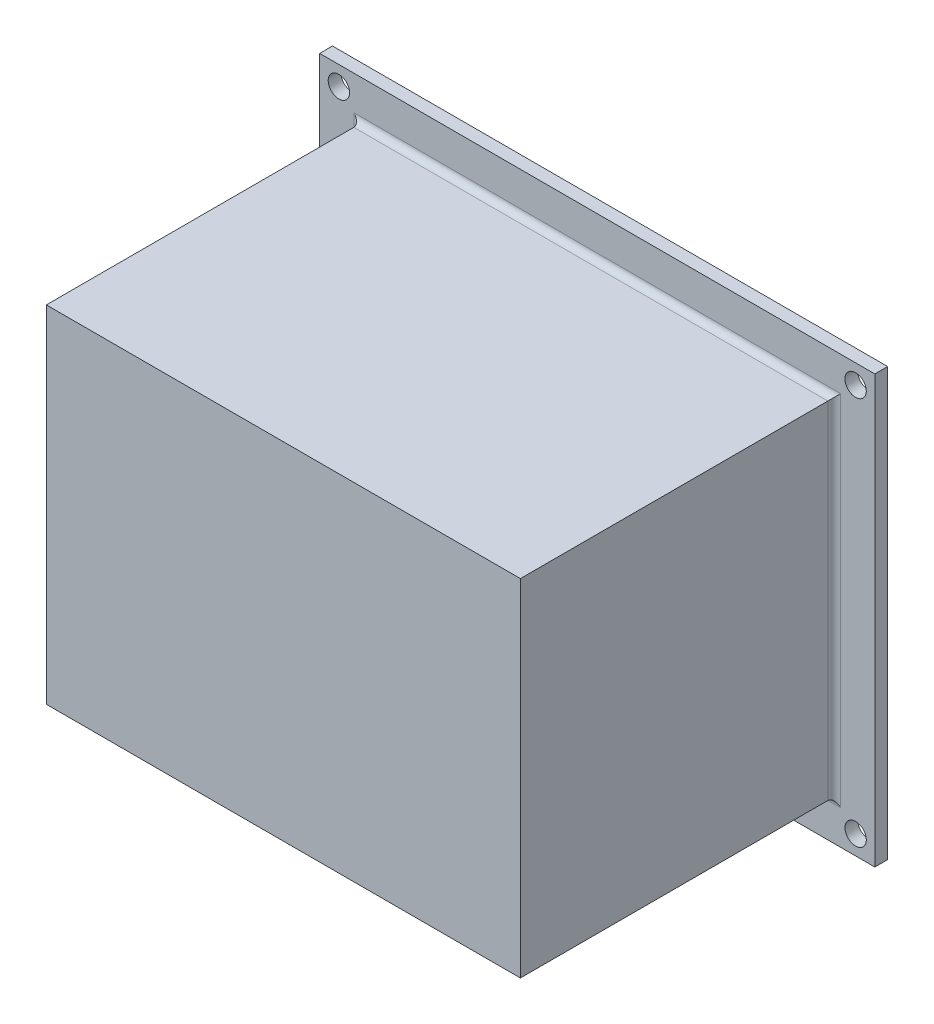
ISO-10303-21;
HEADER;
FILE_DESCRIPTION(('STEP AP214'),'2;1');
FILE_NAME('part.step','',(''),(''),'','','');
FILE_SCHEMA(('AUTOMOTIVE_DESIGN { 1 0 10303 214 1 1 1 1 }'));
ENDSEC;
DATA;
#1=APPLICATION_CONTEXT('core data for automotive mechanical design processes');
#2=APPLICATION_PROTOCOL_DEFINITION('international standard','automotive_design',2000,#1);
#3=PRODUCT_CONTEXT('',#1,'mechanical');
#4=PRODUCT('Part','Part','',(#3));
#5=PRODUCT_RELATED_PRODUCT_CATEGORY('part','',(#4));
#6=PRODUCT_DEFINITION_FORMATION('','',#4);
#7=PRODUCT_DEFINITION_CONTEXT('part definition',#1,'design');
#8=PRODUCT_DEFINITION('design','',#6,#7);
#9=PRODUCT_DEFINITION_SHAPE('','',#8);
#10=(LENGTH_UNIT() NAMED_UNIT(*) SI_UNIT(.MILLI.,.METRE.));
#11=(NAMED_UNIT(*) PLANE_ANGLE_UNIT() SI_UNIT($,.RADIAN.));
#12=(NAMED_UNIT(*) SI_UNIT($,.STERADIAN.) SOLID_ANGLE_UNIT());
#13=UNCERTAINTY_MEASURE_WITH_UNIT(LENGTH_MEASURE(1.E-05),#10,'distance_accuracy_value','');
#14=(GEOMETRIC_REPRESENTATION_CONTEXT(3) GLOBAL_UNCERTAINTY_ASSIGNED_CONTEXT((#13)) GLOBAL_UNIT_ASSIGNED_CONTEXT((#10,
#11,#12)) REPRESENTATION_CONTEXT('',''));
#15=CARTESIAN_POINT('',(0.,0.,0.));
#16=DIRECTION('',(0.,0.,1.));
#17=DIRECTION('',(1.,0.,0.));
#18=AXIS2_PLACEMENT_3D('',#15,#16,#17);
#19=CARTESIAN_POINT('',(0.,0.,3.));
#20=DIRECTION('',(0.,0.,1.));
#21=DIRECTION('',(1.,0.,0.));
#22=AXIS2_PLACEMENT_3D('',#19,#20,#21);
#23=PLANE('',#22);
#24=CARTESIAN_POINT('',(-60.5,-45.5,3.));
#25=DIRECTION('',(0.,0.,1.));
#26=DIRECTION('',(-1.,0.,0.));
#27=AXIS2_PLACEMENT_3D('',#24,#25,#26);
#28=CIRCLE('',#27,2.5);
#29=CARTESIAN_POINT('',(-63.,-45.5,3.));
#30=VERTEX_POINT('',#29);
#31=EDGE_CURVE('E217',#30,#30,#28,.T.);
#32=ORIENTED_EDGE('',*,*,#31,.F.);
#33=EDGE_LOOP('',(#32));
#34=FACE_BOUND('',#33,.T.);
#35=CARTESIAN_POINT('',(60.5,-45.5,3.));
#36=DIRECTION('',(0.,0.,1.));
#37=DIRECTION('',(1.,0.,0.));
#38=AXIS2_PLACEMENT_3D('',#35,#36,#37);
#39=CIRCLE('',#38,2.5);
#40=CARTESIAN_POINT('',(63.,-45.5,3.));
#41=VERTEX_POINT('',#40);
#42=EDGE_CURVE('E223',#41,#41,#39,.T.);
#43=ORIENTED_EDGE('',*,*,#42,.F.);
#44=EDGE_LOOP('',(#43));
#45=FACE_BOUND('',#44,.T.);
#46=CARTESIAN_POINT('',(60.5,45.5,3.));
#47=DIRECTION('',(0.,0.,1.));
#48=DIRECTION('',(-1.,0.,0.));
#49=AXIS2_PLACEMENT_3D('',#46,#47,#48);
#50=CIRCLE('',#49,2.5);
#51=CARTESIAN_POINT('',(58.,45.5,3.));
#52=VERTEX_POINT('',#51);
#53=EDGE_CURVE('E218',#52,#52,#50,.T.);
#54=ORIENTED_EDGE('',*,*,#53,.F.);
#55=EDGE_LOOP('',(#54));
#56=FACE_BOUND('',#55,.T.);
#57=CARTESIAN_POINT('',(-60.5,45.5,3.));
#58=DIRECTION('',(0.,0.,1.));
#59=DIRECTION('',(1.,0.,0.));
#60=AXIS2_PLACEMENT_3D('',#57,#58,#59);
#61=CIRCLE('',#60,2.5);
#62=CARTESIAN_POINT('',(-58.,45.5,3.));
#63=VERTEX_POINT('',#62);
#64=EDGE_CURVE('E222',#63,#63,#61,.T.);
#65=ORIENTED_EDGE('',*,*,#64,.F.);
#66=EDGE_LOOP('',(#65));
#67=FACE_BOUND('',#66,.T.);
#68=DIRECTION('',(0.,1.,0.));
#69=VECTOR('',#68,1.);
#70=CARTESIAN_POINT('',(57.,0.,3.));
#71=LINE('',#70,#69);
#72=CARTESIAN_POINT('',(57.,42.,3.));
#73=VERTEX_POINT('',#72);
#74=CARTESIAN_POINT('',(57.,-42.,3.));
#75=VERTEX_POINT('',#74);
#76=EDGE_CURVE('E330',#73,#75,#71,.F.);
#77=ORIENTED_EDGE('',*,*,#76,.T.);
#78=DIRECTION('',(1.,0.,0.));
#79=VECTOR('',#78,1.);
#80=CARTESIAN_POINT('',(0.,-42.,3.));
#81=LINE('',#80,#79);
#82=CARTESIAN_POINT('',(-57.,-42.,3.));
#83=VERTEX_POINT('',#82);
#84=EDGE_CURVE('E339',#75,#83,#81,.F.);
#85=ORIENTED_EDGE('',*,*,#84,.T.);
#86=DIRECTION('',(0.,-1.,0.));
#87=VECTOR('',#86,1.);
#88=CARTESIAN_POINT('',(-57.,0.,3.));
#89=LINE('',#88,#87);
#90=CARTESIAN_POINT('',(-57.,42.,3.));
#91=VERTEX_POINT('',#90);
#92=EDGE_CURVE('E336',#83,#91,#89,.F.);
#93=ORIENTED_EDGE('',*,*,#92,.T.);
#94=DIRECTION('',(-1.,0.,0.));
#95=VECTOR('',#94,1.);
#96=CARTESIAN_POINT('',(0.,42.,3.));
#97=LINE('',#96,#95);
#98=EDGE_CURVE('E333',#91,#73,#97,.F.);
#99=ORIENTED_EDGE('',*,*,#98,.T.);
#100=EDGE_LOOP('',(#77,#85,#93,#99));
#101=FACE_BOUND('',#100,.T.);
#102=DIRECTION('',(0.,1.,0.));
#103=VECTOR('',#102,1.);
#104=CARTESIAN_POINT('',(65.,50.,3.));
#105=LINE('',#104,#103);
#106=CARTESIAN_POINT('',(65.,-50.,3.));
#107=VERTEX_POINT('',#106);
#108=CARTESIAN_POINT('',(65.,50.,3.));
#109=VERTEX_POINT('',#108);
#110=EDGE_CURVE('E285',#107,#109,#105,.T.);
#111=ORIENTED_EDGE('',*,*,#110,.T.);
#112=DIRECTION('',(-1.,0.,0.));
#113=VECTOR('',#112,1.);
#114=CARTESIAN_POINT('',(-65.,50.,3.));
#115=LINE('',#114,#113);
#116=CARTESIAN_POINT('',(-65.,50.,3.));
#117=VERTEX_POINT('',#116);
#118=EDGE_CURVE('E289',#109,#117,#115,.T.);
#119=ORIENTED_EDGE('',*,*,#118,.T.);
#120=DIRECTION('',(0.,-1.,0.));
#121=VECTOR('',#120,1.);
#122=CARTESIAN_POINT('',(-65.,50.,3.));
#123=LINE('',#122,#121);
#124=CARTESIAN_POINT('',(-65.,-50.,3.));
#125=VERTEX_POINT('',#124);
#126=EDGE_CURVE('E293',#117,#125,#123,.T.);
#127=ORIENTED_EDGE('',*,*,#126,.T.);
#128=DIRECTION('',(1.,0.,0.));
#129=VECTOR('',#128,1.);
#130=CARTESIAN_POINT('',(-65.,-50.,3.));
#131=LINE('',#130,#129);
#132=EDGE_CURVE('E296',#125,#107,#131,.T.);
#133=ORIENTED_EDGE('',*,*,#132,.T.);
#134=EDGE_LOOP('',(#111,#119,#127,#133));
#135=FACE_BOUND('',#134,.T.);
#136=ADVANCED_FACE('F39',(#34,#45,#56,#67,#101,#135),#23,.T.);
#137=CARTESIAN_POINT('',(0.,0.,0.));
#138=DIRECTION('',(0.,0.,1.));
#139=DIRECTION('',(1.,0.,0.));
#140=AXIS2_PLACEMENT_3D('',#137,#138,#139);
#141=PLANE('',#140);
#142=CARTESIAN_POINT('',(-60.5,-45.5,0.));
#143=DIRECTION('',(0.,0.,1.));
#144=DIRECTION('',(1.,0.,0.));
#145=AXIS2_PLACEMENT_3D('',#142,#143,#144);
#146=CIRCLE('',#145,2.5);
#147=CARTESIAN_POINT('',(-58.,-45.5,0.));
#148=VERTEX_POINT('',#147);
#149=EDGE_CURVE('E43',#148,#148,#146,.T.);
#150=ORIENTED_EDGE('',*,*,#149,.T.);
#151=EDGE_LOOP('',(#150));
#152=FACE_BOUND('',#151,.T.);
#153=CARTESIAN_POINT('',(60.5,-45.5,0.));
#154=DIRECTION('',(0.,0.,1.));
#155=DIRECTION('',(1.,0.,0.));
#156=AXIS2_PLACEMENT_3D('',#153,#154,#155);
#157=CIRCLE('',#156,2.5);
#158=CARTESIAN_POINT('',(63.,-45.5,0.));
#159=VERTEX_POINT('',#158);
#160=EDGE_CURVE('E367',#159,#159,#157,.T.);
#161=ORIENTED_EDGE('',*,*,#160,.T.);
#162=EDGE_LOOP('',(#161));
#163=FACE_BOUND('',#162,.T.);
#164=CARTESIAN_POINT('',(60.5,45.5,0.));
#165=DIRECTION('',(0.,0.,1.));
#166=DIRECTION('',(1.,0.,0.));
#167=AXIS2_PLACEMENT_3D('',#164,#165,#166);
#168=CIRCLE('',#167,2.5);
#169=CARTESIAN_POINT('',(63.,45.5,0.));
#170=VERTEX_POINT('',#169);
#171=EDGE_CURVE('E364',#170,#170,#168,.T.);
#172=ORIENTED_EDGE('',*,*,#171,.T.);
#173=EDGE_LOOP('',(#172));
#174=FACE_BOUND('',#173,.T.);
#175=CARTESIAN_POINT('',(-60.5,45.5,0.));
#176=DIRECTION('',(0.,0.,1.));
#177=DIRECTION('',(1.,0.,0.));
#178=AXIS2_PLACEMENT_3D('',#175,#176,#177);
#179=CIRCLE('',#178,2.5);
#180=CARTESIAN_POINT('',(-58.,45.5,0.));
#181=VERTEX_POINT('',#180);
#182=EDGE_CURVE('E233',#181,#181,#179,.T.);
#183=ORIENTED_EDGE('',*,*,#182,.T.);
#184=EDGE_LOOP('',(#183));
#185=FACE_BOUND('',#184,.T.);
#186=DIRECTION('',(0.,1.,0.));
#187=VECTOR('',#186,1.);
#188=CARTESIAN_POINT('',(65.,50.,0.));
#189=LINE('',#188,#187);
#190=CARTESIAN_POINT('',(65.,-50.,0.));
#191=VERTEX_POINT('',#190);
#192=CARTESIAN_POINT('',(65.,50.,0.));
#193=VERTEX_POINT('',#192);
#194=EDGE_CURVE('E284',#191,#193,#189,.T.);
#195=ORIENTED_EDGE('',*,*,#194,.F.);
#196=DIRECTION('',(1.,0.,0.));
#197=VECTOR('',#196,1.);
#198=CARTESIAN_POINT('',(-65.,-50.,0.));
#199=LINE('',#198,#197);
#200=CARTESIAN_POINT('',(-65.,-50.,0.));
#201=VERTEX_POINT('',#200);
#202=EDGE_CURVE('E290',#201,#191,#199,.T.);
#203=ORIENTED_EDGE('',*,*,#202,.F.);
#204=DIRECTION('',(0.,-1.,0.));
#205=VECTOR('',#204,1.);
#206=CARTESIAN_POINT('',(-65.,50.,0.));
#207=LINE('',#206,#205);
#208=CARTESIAN_POINT('',(-65.,50.,0.));
#209=VERTEX_POINT('',#208);
#210=EDGE_CURVE('E306',#209,#201,#207,.T.);
#211=ORIENTED_EDGE('',*,*,#210,.F.);
#212=DIRECTION('',(-1.,0.,0.));
#213=VECTOR('',#212,1.);
#214=CARTESIAN_POINT('',(-65.,50.,0.));
#215=LINE('',#214,#213);
#216=EDGE_CURVE('E303',#193,#209,#215,.T.);
#217=ORIENTED_EDGE('',*,*,#216,.F.);
#218=EDGE_LOOP('',(#195,#203,#211,#217));
#219=FACE_BOUND('',#218,.T.);
#220=DIRECTION('',(0.,1.,0.));
#221=VECTOR('',#220,1.);
#222=CARTESIAN_POINT('',(52.5,37.5,0.));
#223=LINE('',#222,#221);
#224=CARTESIAN_POINT('',(52.5,-37.5,0.));
#225=VERTEX_POINT('',#224);
#226=CARTESIAN_POINT('',(52.5,37.5,0.));
#227=VERTEX_POINT('',#226);
#228=EDGE_CURVE('E264',#225,#227,#223,.T.);
#229=ORIENTED_EDGE('',*,*,#228,.T.);
#230=DIRECTION('',(-1.,0.,0.));
#231=VECTOR('',#230,1.);
#232=CARTESIAN_POINT('',(-52.5,37.5,0.));
#233=LINE('',#232,#231);
#234=CARTESIAN_POINT('',(-52.5,37.5,0.));
#235=VERTEX_POINT('',#234);
#236=EDGE_CURVE('E268',#227,#235,#233,.T.);
#237=ORIENTED_EDGE('',*,*,#236,.T.);
#238=DIRECTION('',(0.,-1.,0.));
#239=VECTOR('',#238,1.);
#240=CARTESIAN_POINT('',(-52.5,37.5,0.));
#241=LINE('',#240,#239);
#242=CARTESIAN_POINT('',(-52.5,-37.5,0.));
#243=VERTEX_POINT('',#242);
#244=EDGE_CURVE('E272',#235,#243,#241,.T.);
#245=ORIENTED_EDGE('',*,*,#244,.T.);
#246=DIRECTION('',(1.,0.,0.));
#247=VECTOR('',#246,1.);
#248=CARTESIAN_POINT('',(-52.5,-37.5,0.));
#249=LINE('',#248,#247);
#250=EDGE_CURVE('E166',#243,#225,#249,.T.);
#251=ORIENTED_EDGE('',*,*,#250,.T.);
#252=EDGE_LOOP('',(#229,#237,#245,#251));
#253=FACE_BOUND('',#252,.T.);
#254=ADVANCED_FACE('F376',(#152,#163,#174,#185,#219,#253),#141,.F.);
#255=CARTESIAN_POINT('',(65.,50.,3.));
#256=DIRECTION('',(-1.,0.,0.));
#257=DIRECTION('',(0.,0.,1.));
#258=AXIS2_PLACEMENT_3D('',#255,#256,#257);
#259=PLANE('',#258);
#260=ORIENTED_EDGE('',*,*,#194,.T.);
#261=DIRECTION('',(0.,0.,-1.));
#262=VECTOR('',#261,1.);
#263=CARTESIAN_POINT('',(65.,50.,3.));
#264=LINE('',#263,#262);
#265=EDGE_CURVE('E322',#109,#193,#264,.T.);
#266=ORIENTED_EDGE('',*,*,#265,.F.);
#267=ORIENTED_EDGE('',*,*,#110,.F.);
#268=DIRECTION('',(0.,0.,-1.));
#269=VECTOR('',#268,1.);
#270=CARTESIAN_POINT('',(65.,-50.,3.));
#271=LINE('',#270,#269);
#272=EDGE_CURVE('E299',#107,#191,#271,.T.);
#273=ORIENTED_EDGE('',*,*,#272,.T.);
#274=EDGE_LOOP('',(#260,#266,#267,#273));
#275=FACE_BOUND('',#274,.T.);
#276=ADVANCED_FACE('F401',(#275),#259,.F.);
#277=CARTESIAN_POINT('',(-65.,50.,3.));
#278=DIRECTION('',(0.,-1.,0.));
#279=DIRECTION('',(0.,0.,-1.));
#280=AXIS2_PLACEMENT_3D('',#277,#278,#279);
#281=PLANE('',#280);
#282=ORIENTED_EDGE('',*,*,#216,.T.);
#283=DIRECTION('',(0.,0.,-1.));
#284=VECTOR('',#283,1.);
#285=CARTESIAN_POINT('',(-65.,50.,3.));
#286=LINE('',#285,#284);
#287=EDGE_CURVE('E318',#117,#209,#286,.T.);
#288=ORIENTED_EDGE('',*,*,#287,.F.);
#289=ORIENTED_EDGE('',*,*,#118,.F.);
#290=ORIENTED_EDGE('',*,*,#265,.T.);
#291=EDGE_LOOP('',(#282,#288,#289,#290));
#292=FACE_BOUND('',#291,.T.);
#293=ADVANCED_FACE('F416',(#292),#281,.F.);
#294=CARTESIAN_POINT('',(-65.,50.,3.));
#295=DIRECTION('',(1.,0.,0.));
#296=DIRECTION('',(0.,0.,-1.));
#297=AXIS2_PLACEMENT_3D('',#294,#295,#296);
#298=PLANE('',#297);
#299=ORIENTED_EDGE('',*,*,#210,.T.);
#300=DIRECTION('',(0.,0.,-1.));
#301=VECTOR('',#300,1.);
#302=CARTESIAN_POINT('',(-65.,-50.,3.));
#303=LINE('',#302,#301);
#304=EDGE_CURVE('E314',#125,#201,#303,.T.);
#305=ORIENTED_EDGE('',*,*,#304,.F.);
#306=ORIENTED_EDGE('',*,*,#126,.F.);
#307=ORIENTED_EDGE('',*,*,#287,.T.);
#308=EDGE_LOOP('',(#299,#305,#306,#307));
#309=FACE_BOUND('',#308,.T.);
#310=ADVANCED_FACE('F412',(#309),#298,.F.);
#311=CARTESIAN_POINT('',(-65.,-50.,3.));
#312=DIRECTION('',(0.,1.,0.));
#313=DIRECTION('',(0.,0.,1.));
#314=AXIS2_PLACEMENT_3D('',#311,#312,#313);
#315=PLANE('',#314);
#316=ORIENTED_EDGE('',*,*,#202,.T.);
#317=ORIENTED_EDGE('',*,*,#272,.F.);
#318=ORIENTED_EDGE('',*,*,#132,.F.);
#319=ORIENTED_EDGE('',*,*,#304,.T.);
#320=EDGE_LOOP('',(#316,#317,#318,#319));
#321=FACE_BOUND('',#320,.T.);
#322=ADVANCED_FACE('F409',(#321),#315,.F.);
#323=CARTESIAN_POINT('',(52.5,37.5,3.));
#324=DIRECTION('',(-1.,0.,0.));
#325=DIRECTION('',(0.,0.,1.));
#326=AXIS2_PLACEMENT_3D('',#323,#324,#325);
#327=PLANE('',#326);
#328=DIRECTION('',(0.,1.,0.));
#329=VECTOR('',#328,1.);
#330=CARTESIAN_POINT('',(52.5,-37.5,74.));
#331=LINE('',#330,#329);
#332=CARTESIAN_POINT('',(52.5,-37.5,74.));
#333=VERTEX_POINT('',#332);
#334=CARTESIAN_POINT('',(52.5,37.5,74.));
#335=VERTEX_POINT('',#334);
#336=EDGE_CURVE('E57',#333,#335,#331,.T.);
#337=ORIENTED_EDGE('',*,*,#336,.T.);
#338=DIRECTION('',(0.,0.,-1.));
#339=VECTOR('',#338,1.);
#340=CARTESIAN_POINT('',(52.5,37.5,3.));
#341=LINE('',#340,#339);
#342=EDGE_CURVE('E281',#335,#227,#341,.T.);
#343=ORIENTED_EDGE('',*,*,#342,.T.);
#344=ORIENTED_EDGE('',*,*,#228,.F.);
#345=DIRECTION('',(0.,0.,-1.));
#346=VECTOR('',#345,1.);
#347=CARTESIAN_POINT('',(52.5,-37.5,3.));
#348=LINE('',#347,#346);
#349=EDGE_CURVE('E172',#333,#225,#348,.T.);
#350=ORIENTED_EDGE('',*,*,#349,.F.);
#351=EDGE_LOOP('',(#337,#343,#344,#350));
#352=FACE_BOUND('',#351,.T.);
#353=ADVANCED_FACE('F406',(#352),#327,.T.);
#354=CARTESIAN_POINT('',(-52.5,37.5,3.));
#355=DIRECTION('',(0.,-1.,0.));
#356=DIRECTION('',(0.,0.,-1.));
#357=AXIS2_PLACEMENT_3D('',#354,#355,#356);
#358=PLANE('',#357);
#359=DIRECTION('',(-1.,0.,0.));
#360=VECTOR('',#359,1.);
#361=CARTESIAN_POINT('',(-52.5,37.5,74.));
#362=LINE('',#361,#360);
#363=CARTESIAN_POINT('',(-52.5,37.5,74.));
#364=VERTEX_POINT('',#363);
#365=EDGE_CURVE('E64',#335,#364,#362,.T.);
#366=ORIENTED_EDGE('',*,*,#365,.T.);
#367=DIRECTION('',(0.,0.,-1.));
#368=VECTOR('',#367,1.);
#369=CARTESIAN_POINT('',(-52.5,37.5,3.));
#370=LINE('',#369,#368);
#371=EDGE_CURVE('E171',#364,#235,#370,.T.);
#372=ORIENTED_EDGE('',*,*,#371,.T.);
#373=ORIENTED_EDGE('',*,*,#236,.F.);
#374=ORIENTED_EDGE('',*,*,#342,.F.);
#375=EDGE_LOOP('',(#366,#372,#373,#374));
#376=FACE_BOUND('',#375,.T.);
#377=ADVANCED_FACE('F484',(#376),#358,.T.);
#378=CARTESIAN_POINT('',(-52.5,37.5,3.));
#379=DIRECTION('',(1.,0.,0.));
#380=DIRECTION('',(0.,0.,-1.));
#381=AXIS2_PLACEMENT_3D('',#378,#379,#380);
#382=PLANE('',#381);
#383=DIRECTION('',(0.,-1.,0.));
#384=VECTOR('',#383,1.);
#385=CARTESIAN_POINT('',(-52.5,-37.5,74.));
#386=LINE('',#385,#384);
#387=CARTESIAN_POINT('',(-52.5,-37.5,74.));
#388=VERTEX_POINT('',#387);
#389=EDGE_CURVE('E175',#364,#388,#386,.T.);
#390=ORIENTED_EDGE('',*,*,#389,.T.);
#391=DIRECTION('',(0.,0.,-1.));
#392=VECTOR('',#391,1.);
#393=CARTESIAN_POINT('',(-52.5,-37.5,3.));
#394=LINE('',#393,#392);
#395=EDGE_CURVE('E160',#388,#243,#394,.T.);
#396=ORIENTED_EDGE('',*,*,#395,.T.);
#397=ORIENTED_EDGE('',*,*,#244,.F.);
#398=ORIENTED_EDGE('',*,*,#371,.F.);
#399=EDGE_LOOP('',(#390,#396,#397,#398));
#400=FACE_BOUND('',#399,.T.);
#401=DIRECTION('',(0.,0.5,0.866025403784438));
#402=VECTOR('',#401,1.);
#403=CARTESIAN_POINT('',(-52.5,-0.151279441628821,24.7379763209582));
#404=LINE('',#403,#402);
#405=CARTESIAN_POINT('',(-52.5,0.,25.));
#406=VERTEX_POINT('',#405);
#407=CARTESIAN_POINT('',(-52.5,12.9903810567666,47.5));
#408=VERTEX_POINT('',#407);
#409=EDGE_CURVE('E214',#406,#408,#404,.T.);
#410=ORIENTED_EDGE('',*,*,#409,.F.);
#411=DIRECTION('',(0.,0.5,-0.866025403784439));
#412=VECTOR('',#411,1.);
#413=CARTESIAN_POINT('',(-52.5,18.9012794416288,-7.73797632095823));
#414=LINE('',#413,#412);
#415=CARTESIAN_POINT('',(-52.5,-12.9903810567666,47.5));
#416=VERTEX_POINT('',#415);
#417=EDGE_CURVE('E201',#416,#406,#414,.T.);
#418=ORIENTED_EDGE('',*,*,#417,.F.);
#419=DIRECTION('',(0.,-1.,0.));
#420=VECTOR('',#419,1.);
#421=CARTESIAN_POINT('',(-52.5,37.5,47.5));
#422=LINE('',#421,#420);
#423=EDGE_CURVE('E210',#408,#416,#422,.T.);
#424=ORIENTED_EDGE('',*,*,#423,.F.);
#425=EDGE_LOOP('',(#410,#418,#424));
#426=FACE_BOUND('',#425,.T.);
#427=ADVANCED_FACE('F176',(#400,#426),#382,.T.);
#428=CARTESIAN_POINT('',(-52.5,-37.5,3.));
#429=DIRECTION('',(0.,1.,0.));
#430=DIRECTION('',(0.,0.,1.));
#431=AXIS2_PLACEMENT_3D('',#428,#429,#430);
#432=PLANE('',#431);
#433=DIRECTION('',(1.,0.,0.));
#434=VECTOR('',#433,1.);
#435=CARTESIAN_POINT('',(-52.5,-37.5,74.));
#436=LINE('',#435,#434);
#437=EDGE_CURVE('E164',#388,#333,#436,.T.);
#438=ORIENTED_EDGE('',*,*,#437,.T.);
#439=ORIENTED_EDGE('',*,*,#349,.T.);
#440=ORIENTED_EDGE('',*,*,#250,.F.);
#441=ORIENTED_EDGE('',*,*,#395,.F.);
#442=EDGE_LOOP('',(#438,#439,#440,#441));
#443=FACE_BOUND('',#442,.T.);
#444=ADVANCED_FACE('F162',(#443),#432,.T.);
#445=CARTESIAN_POINT('',(0.,0.,76.5));
#446=DIRECTION('',(0.,0.,1.));
#447=DIRECTION('',(1.,0.,0.));
#448=AXIS2_PLACEMENT_3D('',#445,#446,#447);
#449=PLANE('',#448);
#450=DIRECTION('',(0.,1.,0.));
#451=VECTOR('',#450,1.);
#452=CARTESIAN_POINT('',(55.5,40.5,76.5));
#453=LINE('',#452,#451);
#454=CARTESIAN_POINT('',(55.5,-40.5,76.5));
#455=VERTEX_POINT('',#454);
#456=CARTESIAN_POINT('',(55.5,40.5,76.5));
#457=VERTEX_POINT('',#456);
#458=EDGE_CURVE('E234',#455,#457,#453,.T.);
#459=ORIENTED_EDGE('',*,*,#458,.T.);
#460=DIRECTION('',(-1.,0.,0.));
#461=VECTOR('',#460,1.);
#462=CARTESIAN_POINT('',(-55.5,40.5,76.5));
#463=LINE('',#462,#461);
#464=CARTESIAN_POINT('',(-55.5,40.5,76.5));
#465=VERTEX_POINT('',#464);
#466=EDGE_CURVE('E238',#457,#465,#463,.T.);
#467=ORIENTED_EDGE('',*,*,#466,.T.);
#468=DIRECTION('',(0.,-1.,0.));
#469=VECTOR('',#468,1.);
#470=CARTESIAN_POINT('',(-55.5,40.5,76.5));
#471=LINE('',#470,#469);
#472=CARTESIAN_POINT('',(-55.5,-40.5,76.5));
#473=VERTEX_POINT('',#472);
#474=EDGE_CURVE('E242',#465,#473,#471,.T.);
#475=ORIENTED_EDGE('',*,*,#474,.T.);
#476=DIRECTION('',(1.,0.,0.));
#477=VECTOR('',#476,1.);
#478=CARTESIAN_POINT('',(-55.5,-40.5,76.5));
#479=LINE('',#478,#477);
#480=EDGE_CURVE('E245',#473,#455,#479,.T.);
#481=ORIENTED_EDGE('',*,*,#480,.T.);
#482=EDGE_LOOP('',(#459,#467,#475,#481));
#483=FACE_BOUND('',#482,.T.);
#484=ADVANCED_FACE('F463',(#483),#449,.T.);
#485=CARTESIAN_POINT('',(55.5,40.5,76.5));
#486=DIRECTION('',(-1.,0.,0.));
#487=DIRECTION('',(0.,0.,1.));
#488=AXIS2_PLACEMENT_3D('',#485,#486,#487);
#489=PLANE('',#488);
#490=DIRECTION('',(0.,0.,-1.));
#491=VECTOR('',#490,1.);
#492=CARTESIAN_POINT('',(55.5,-40.5,76.5));
#493=LINE('',#492,#491);
#494=CARTESIAN_POINT('',(55.5,-40.5,4.5));
#495=VERTEX_POINT('',#494);
#496=EDGE_CURVE('E248',#455,#495,#493,.T.);
#497=ORIENTED_EDGE('',*,*,#496,.T.);
#498=DIRECTION('',(0.,1.,0.));
#499=VECTOR('',#498,1.);
#500=CARTESIAN_POINT('',(55.5,40.5,4.5));
#501=LINE('',#500,#499);
#502=CARTESIAN_POINT('',(55.5,40.5,4.5));
#503=VERTEX_POINT('',#502);
#504=EDGE_CURVE('E11',#495,#503,#501,.T.);
#505=ORIENTED_EDGE('',*,*,#504,.T.);
#506=DIRECTION('',(0.,0.,-1.));
#507=VECTOR('',#506,1.);
#508=CARTESIAN_POINT('',(55.5,40.5,76.5));
#509=LINE('',#508,#507);
#510=EDGE_CURVE('E260',#457,#503,#509,.T.);
#511=ORIENTED_EDGE('',*,*,#510,.F.);
#512=ORIENTED_EDGE('',*,*,#458,.F.);
#513=EDGE_LOOP('',(#497,#505,#511,#512));
#514=FACE_BOUND('',#513,.T.);
#515=ADVANCED_FACE('F461',(#514),#489,.F.);
#516=CARTESIAN_POINT('',(-55.5,40.5,76.5));
#517=DIRECTION('',(0.,-1.,0.));
#518=DIRECTION('',(0.,0.,-1.));
#519=AXIS2_PLACEMENT_3D('',#516,#517,#518);
#520=PLANE('',#519);
#521=ORIENTED_EDGE('',*,*,#510,.T.);
#522=DIRECTION('',(-1.,0.,0.));
#523=VECTOR('',#522,1.);
#524=CARTESIAN_POINT('',(-55.5,40.5,4.5));
#525=LINE('',#524,#523);
#526=CARTESIAN_POINT('',(-55.5,40.5,4.5));
#527=VERTEX_POINT('',#526);
#528=EDGE_CURVE('E49',#503,#527,#525,.T.);
#529=ORIENTED_EDGE('',*,*,#528,.T.);
#530=DIRECTION('',(0.,0.,-1.));
#531=VECTOR('',#530,1.);
#532=CARTESIAN_POINT('',(-55.5,40.5,76.5));
#533=LINE('',#532,#531);
#534=EDGE_CURVE('E256',#465,#527,#533,.T.);
#535=ORIENTED_EDGE('',*,*,#534,.F.);
#536=ORIENTED_EDGE('',*,*,#466,.F.);
#537=EDGE_LOOP('',(#521,#529,#535,#536));
#538=FACE_BOUND('',#537,.T.);
#539=ADVANCED_FACE('F469',(#538),#520,.F.);
#540=CARTESIAN_POINT('',(-55.5,40.5,76.5));
#541=DIRECTION('',(1.,0.,0.));
#542=DIRECTION('',(0.,0.,-1.));
#543=AXIS2_PLACEMENT_3D('',#540,#541,#542);
#544=PLANE('',#543);
#545=DIRECTION('',(0.,-0.5,0.866025403784439));
#546=VECTOR('',#545,1.);
#547=CARTESIAN_POINT('',(-55.5,0.,25.));
#548=LINE('',#547,#546);
#549=CARTESIAN_POINT('',(-55.5,0.,25.));
#550=VERTEX_POINT('',#549);
#551=CARTESIAN_POINT('',(-55.5,-12.9903810567666,47.5));
#552=VERTEX_POINT('',#551);
#553=EDGE_CURVE('E186',#550,#552,#548,.T.);
#554=ORIENTED_EDGE('',*,*,#553,.F.);
#555=DIRECTION('',(0.,-0.5,-0.866025403784438));
#556=VECTOR('',#555,1.);
#557=CARTESIAN_POINT('',(-55.5,12.9903810567666,47.5));
#558=LINE('',#557,#556);
#559=CARTESIAN_POINT('',(-55.5,12.9903810567666,47.5));
#560=VERTEX_POINT('',#559);
#561=EDGE_CURVE('E183',#560,#550,#558,.T.);
#562=ORIENTED_EDGE('',*,*,#561,.F.);
#563=DIRECTION('',(0.,1.,0.));
#564=VECTOR('',#563,1.);
#565=CARTESIAN_POINT('',(-55.5,-12.9903810567666,47.5));
#566=LINE('',#565,#564);
#567=EDGE_CURVE('E193',#552,#560,#566,.T.);
#568=ORIENTED_EDGE('',*,*,#567,.F.);
#569=EDGE_LOOP('',(#554,#562,#568));
#570=FACE_BOUND('',#569,.T.);
#571=ORIENTED_EDGE('',*,*,#534,.T.);
#572=DIRECTION('',(0.,-1.,0.));
#573=VECTOR('',#572,1.);
#574=CARTESIAN_POINT('',(-55.5,40.5,4.5));
#575=LINE('',#574,#573);
#576=CARTESIAN_POINT('',(-55.5,-40.5,4.5));
#577=VERTEX_POINT('',#576);
#578=EDGE_CURVE('E343',#527,#577,#575,.T.);
#579=ORIENTED_EDGE('',*,*,#578,.T.);
#580=DIRECTION('',(0.,0.,-1.));
#581=VECTOR('',#580,1.);
#582=CARTESIAN_POINT('',(-55.5,-40.5,76.5));
#583=LINE('',#582,#581);
#584=EDGE_CURVE('E252',#473,#577,#583,.T.);
#585=ORIENTED_EDGE('',*,*,#584,.F.);
#586=ORIENTED_EDGE('',*,*,#474,.F.);
#587=EDGE_LOOP('',(#571,#579,#585,#586));
#588=FACE_BOUND('',#587,.T.);
#589=ADVANCED_FACE('F467',(#570,#588),#544,.F.);
#590=CARTESIAN_POINT('',(-55.5,-40.5,76.5));
#591=DIRECTION('',(0.,1.,0.));
#592=DIRECTION('',(0.,0.,1.));
#593=AXIS2_PLACEMENT_3D('',#590,#591,#592);
#594=PLANE('',#593);
#595=ORIENTED_EDGE('',*,*,#584,.T.);
#596=DIRECTION('',(1.,0.,0.));
#597=VECTOR('',#596,1.);
#598=CARTESIAN_POINT('',(-55.5,-40.5,4.5));
#599=LINE('',#598,#597);
#600=EDGE_CURVE('E326',#577,#495,#599,.T.);
#601=ORIENTED_EDGE('',*,*,#600,.T.);
#602=ORIENTED_EDGE('',*,*,#496,.F.);
#603=ORIENTED_EDGE('',*,*,#480,.F.);
#604=EDGE_LOOP('',(#595,#601,#602,#603));
#605=FACE_BOUND('',#604,.T.);
#606=ADVANCED_FACE('F438',(#605),#594,.F.);
#607=CARTESIAN_POINT('',(-55.5,42.,4.5));
#608=DIRECTION('',(-1.,0.,0.));
#609=DIRECTION('',(0.,0.,1.));
#610=AXIS2_PLACEMENT_3D('',#607,#608,#609);
#611=CYLINDRICAL_SURFACE('',#610,1.5);
#612=CARTESIAN_POINT('',(57.,42.,4.5));
#613=DIRECTION('',(-0.707106781186547,0.707106781186547,0.));
#614=DIRECTION('',(0.707106781186547,0.707106781186547,0.));
#615=AXIS2_PLACEMENT_3D('',#612,#613,#614);
#616=ELLIPSE('',#615,2.12132034355964,1.5);
#617=EDGE_CURVE('E354',#73,#503,#616,.T.);
#618=ORIENTED_EDGE('',*,*,#617,.F.);
#619=ORIENTED_EDGE('',*,*,#98,.F.);
#620=CARTESIAN_POINT('',(-57.,42.,4.5));
#621=DIRECTION('',(-0.707106781186547,-0.707106781186547,0.));
#622=DIRECTION('',(-0.707106781186547,0.707106781186547,0.));
#623=AXIS2_PLACEMENT_3D('',#620,#621,#622);
#624=ELLIPSE('',#623,2.12132034355964,1.5);
#625=EDGE_CURVE('E239',#527,#91,#624,.F.);
#626=ORIENTED_EDGE('',*,*,#625,.F.);
#627=ORIENTED_EDGE('',*,*,#528,.F.);
#628=EDGE_LOOP('',(#618,#619,#626,#627));
#629=FACE_BOUND('',#628,.T.);
#630=ADVANCED_FACE('F41',(#629),#611,.F.);
#631=CARTESIAN_POINT('',(-57.,40.5,4.5));
#632=DIRECTION('',(0.,-1.,0.));
#633=DIRECTION('',(0.,0.,-1.));
#634=AXIS2_PLACEMENT_3D('',#631,#632,#633);
#635=CYLINDRICAL_SURFACE('',#634,1.5);
#636=ORIENTED_EDGE('',*,*,#625,.T.);
#637=ORIENTED_EDGE('',*,*,#92,.F.);
#638=CARTESIAN_POINT('',(-57.,-42.,4.5));
#639=DIRECTION('',(0.707106781186547,-0.707106781186547,0.));
#640=DIRECTION('',(-0.707106781186547,-0.707106781186547,0.));
#641=AXIS2_PLACEMENT_3D('',#638,#639,#640);
#642=ELLIPSE('',#641,2.12132034355964,1.5);
#643=EDGE_CURVE('E351',#577,#83,#642,.F.);
#644=ORIENTED_EDGE('',*,*,#643,.F.);
#645=ORIENTED_EDGE('',*,*,#578,.F.);
#646=EDGE_LOOP('',(#636,#637,#644,#645));
#647=FACE_BOUND('',#646,.T.);
#648=ADVANCED_FACE('F431',(#647),#635,.F.);
#649=CARTESIAN_POINT('',(57.,40.5,4.5));
#650=DIRECTION('',(0.,1.,0.));
#651=DIRECTION('',(0.,0.,1.));
#652=AXIS2_PLACEMENT_3D('',#649,#650,#651);
#653=CYLINDRICAL_SURFACE('',#652,1.5);
#654=ORIENTED_EDGE('',*,*,#617,.T.);
#655=ORIENTED_EDGE('',*,*,#504,.F.);
#656=CARTESIAN_POINT('',(57.,-42.,4.5));
#657=DIRECTION('',(0.707106781186547,0.707106781186547,0.));
#658=DIRECTION('',(-0.707106781186547,0.707106781186547,0.));
#659=AXIS2_PLACEMENT_3D('',#656,#657,#658);
#660=ELLIPSE('',#659,2.12132034355964,1.5);
#661=EDGE_CURVE('E348',#75,#495,#660,.T.);
#662=ORIENTED_EDGE('',*,*,#661,.F.);
#663=ORIENTED_EDGE('',*,*,#76,.F.);
#664=EDGE_LOOP('',(#654,#655,#662,#663));
#665=FACE_BOUND('',#664,.T.);
#666=ADVANCED_FACE('F428',(#665),#653,.F.);
#667=CARTESIAN_POINT('',(-55.5,-42.,4.5));
#668=DIRECTION('',(1.,0.,0.));
#669=DIRECTION('',(0.,0.,-1.));
#670=AXIS2_PLACEMENT_3D('',#667,#668,#669);
#671=CYLINDRICAL_SURFACE('',#670,1.5);
#672=ORIENTED_EDGE('',*,*,#643,.T.);
#673=ORIENTED_EDGE('',*,*,#84,.F.);
#674=ORIENTED_EDGE('',*,*,#661,.T.);
#675=ORIENTED_EDGE('',*,*,#600,.F.);
#676=EDGE_LOOP('',(#672,#673,#674,#675));
#677=FACE_BOUND('',#676,.T.);
#678=ADVANCED_FACE('F424',(#677),#671,.F.);
#679=CARTESIAN_POINT('',(-60.5,45.5,-110.5));
#680=DIRECTION('',(0.,0.,1.));
#681=DIRECTION('',(1.,0.,0.));
#682=AXIS2_PLACEMENT_3D('',#679,#680,#681);
#683=CYLINDRICAL_SURFACE('',#682,2.5);
#684=ORIENTED_EDGE('',*,*,#64,.T.);
#685=EDGE_LOOP('',(#684));
#686=FACE_BOUND('',#685,.T.);
#687=ORIENTED_EDGE('',*,*,#182,.F.);
#688=EDGE_LOOP('',(#687));
#689=FACE_BOUND('',#688,.T.);
#690=ADVANCED_FACE('F427',(#686,#689),#683,.F.);
#691=CARTESIAN_POINT('',(60.5,45.5,-110.5));
#692=DIRECTION('',(0.,0.,1.));
#693=DIRECTION('',(1.,0.,0.));
#694=AXIS2_PLACEMENT_3D('',#691,#692,#693);
#695=CYLINDRICAL_SURFACE('',#694,2.5);
#696=ORIENTED_EDGE('',*,*,#53,.T.);
#697=EDGE_LOOP('',(#696));
#698=FACE_BOUND('',#697,.T.);
#699=ORIENTED_EDGE('',*,*,#171,.F.);
#700=EDGE_LOOP('',(#699));
#701=FACE_BOUND('',#700,.T.);
#702=ADVANCED_FACE('F391',(#698,#701),#695,.F.);
#703=CARTESIAN_POINT('',(60.5,-45.5,-110.5));
#704=DIRECTION('',(0.,0.,1.));
#705=DIRECTION('',(1.,0.,0.));
#706=AXIS2_PLACEMENT_3D('',#703,#704,#705);
#707=CYLINDRICAL_SURFACE('',#706,2.5);
#708=ORIENTED_EDGE('',*,*,#42,.T.);
#709=EDGE_LOOP('',(#708));
#710=FACE_BOUND('',#709,.T.);
#711=ORIENTED_EDGE('',*,*,#160,.F.);
#712=EDGE_LOOP('',(#711));
#713=FACE_BOUND('',#712,.T.);
#714=ADVANCED_FACE('F381',(#710,#713),#707,.F.);
#715=CARTESIAN_POINT('',(-60.5,-45.5,-110.5));
#716=DIRECTION('',(0.,0.,1.));
#717=DIRECTION('',(1.,0.,0.));
#718=AXIS2_PLACEMENT_3D('',#715,#716,#717);
#719=CYLINDRICAL_SURFACE('',#718,2.5);
#720=ORIENTED_EDGE('',*,*,#31,.T.);
#721=EDGE_LOOP('',(#720));
#722=FACE_BOUND('',#721,.T.);
#723=ORIENTED_EDGE('',*,*,#149,.F.);
#724=EDGE_LOOP('',(#723));
#725=FACE_BOUND('',#724,.T.);
#726=ADVANCED_FACE('F378',(#722,#725),#719,.F.);
#727=CARTESIAN_POINT('',(18.,12.9903810567666,47.5));
#728=DIRECTION('',(0.,0.866025403784439,-0.5));
#729=DIRECTION('',(0.,0.5,0.866025403784438));
#730=AXIS2_PLACEMENT_3D('',#727,#728,#729);
#731=PLANE('',#730);
#732=ORIENTED_EDGE('',*,*,#409,.T.);
#733=DIRECTION('',(-1.,0.,0.));
#734=VECTOR('',#733,1.);
#735=CARTESIAN_POINT('',(18.,12.9903810567666,47.5));
#736=LINE('',#735,#734);
#737=EDGE_CURVE('E198',#408,#560,#736,.T.);
#738=ORIENTED_EDGE('',*,*,#737,.T.);
#739=ORIENTED_EDGE('',*,*,#561,.T.);
#740=DIRECTION('',(-1.,0.,0.));
#741=VECTOR('',#740,1.);
#742=CARTESIAN_POINT('',(18.,0.,25.));
#743=LINE('',#742,#741);
#744=EDGE_CURVE('E197',#406,#550,#743,.T.);
#745=ORIENTED_EDGE('',*,*,#744,.F.);
#746=EDGE_LOOP('',(#732,#738,#739,#745));
#747=FACE_BOUND('',#746,.T.);
#748=ADVANCED_FACE('F380',(#747),#731,.F.);
#749=CARTESIAN_POINT('',(18.,-12.9903810567666,47.5));
#750=DIRECTION('',(0.,0.,1.));
#751=DIRECTION('',(0.,-1.,0.));
#752=AXIS2_PLACEMENT_3D('',#749,#750,#751);
#753=PLANE('',#752);
#754=ORIENTED_EDGE('',*,*,#423,.T.);
#755=DIRECTION('',(-1.,0.,0.));
#756=VECTOR('',#755,1.);
#757=CARTESIAN_POINT('',(18.,-12.9903810567666,47.5));
#758=LINE('',#757,#756);
#759=EDGE_CURVE('E202',#416,#552,#758,.T.);
#760=ORIENTED_EDGE('',*,*,#759,.T.);
#761=ORIENTED_EDGE('',*,*,#567,.T.);
#762=ORIENTED_EDGE('',*,*,#737,.F.);
#763=EDGE_LOOP('',(#754,#760,#761,#762));
#764=FACE_BOUND('',#763,.T.);
#765=ADVANCED_FACE('F388',(#764),#753,.F.);
#766=CARTESIAN_POINT('',(18.,0.,25.));
#767=DIRECTION('',(0.,-0.866025403784439,-0.5));
#768=DIRECTION('',(0.,0.5,-0.866025403784439));
#769=AXIS2_PLACEMENT_3D('',#766,#767,#768);
#770=PLANE('',#769);
#771=ORIENTED_EDGE('',*,*,#417,.T.);
#772=ORIENTED_EDGE('',*,*,#744,.T.);
#773=ORIENTED_EDGE('',*,*,#553,.T.);
#774=ORIENTED_EDGE('',*,*,#759,.F.);
#775=EDGE_LOOP('',(#771,#772,#773,#774));
#776=FACE_BOUND('',#775,.T.);
#777=ADVANCED_FACE('F567',(#776),#770,.F.);
#778=CARTESIAN_POINT('',(0.,0.,74.));
#779=DIRECTION('',(0.,0.,-1.));
#780=DIRECTION('',(-1.,0.,0.));
#781=AXIS2_PLACEMENT_3D('',#778,#779,#780);
#782=PLANE('',#781);
#783=ORIENTED_EDGE('',*,*,#336,.F.);
#784=ORIENTED_EDGE('',*,*,#437,.F.);
#785=ORIENTED_EDGE('',*,*,#389,.F.);
#786=ORIENTED_EDGE('',*,*,#365,.F.);
#787=EDGE_LOOP('',(#783,#784,#785,#786));
#788=FACE_BOUND('',#787,.T.);
#789=ADVANCED_FACE('F181',(#788),#782,.T.);
#790=CLOSED_SHELL('',(#136,#254,#276,#293,#310,#322,#353,#377,#427,#444,#484,#515,#539,#589,
#606,#630,#648,#666,#678,#690,#702,#714,#726,#748,#765,#777,#789));
#791=MANIFOLD_SOLID_BREP('B2',#790);
#792=ADVANCED_BREP_SHAPE_REPRESENTATION('',(#18,#791),#14);
#793=SHAPE_DEFINITION_REPRESENTATION(#9,#792);
ENDSEC;
END-ISO-10303-21;
